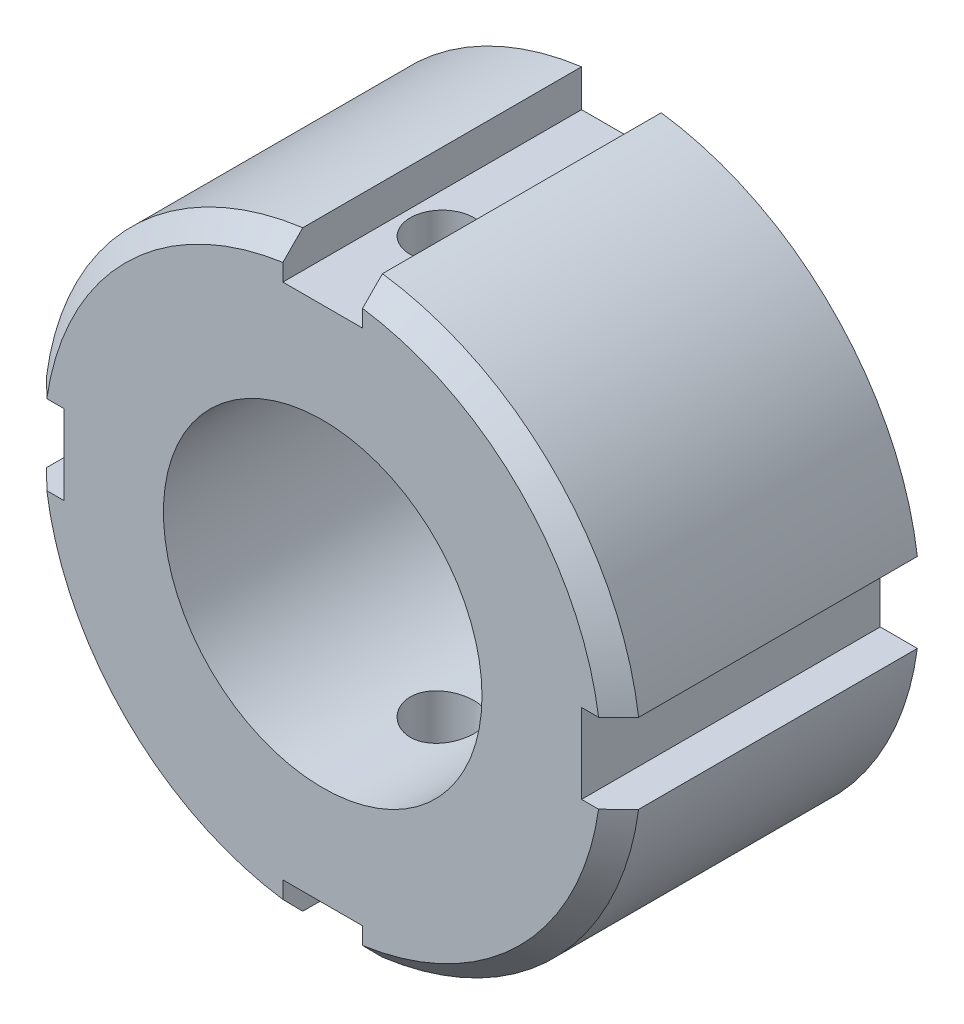
ISO-10303-21;
HEADER;
FILE_DESCRIPTION(('STEP AP214'),'2;1');
FILE_NAME('part.step','',(''),(''),'','','');
FILE_SCHEMA(('AUTOMOTIVE_DESIGN { 1 0 10303 214 1 1 1 1 }'));
ENDSEC;
DATA;
#1=APPLICATION_CONTEXT('core data for automotive mechanical design processes');
#2=APPLICATION_PROTOCOL_DEFINITION('international standard','automotive_design',2000,#1);
#3=PRODUCT_CONTEXT('',#1,'mechanical');
#4=PRODUCT('Part','Part','',(#3));
#5=PRODUCT_RELATED_PRODUCT_CATEGORY('part','',(#4));
#6=PRODUCT_DEFINITION_FORMATION('','',#4);
#7=PRODUCT_DEFINITION_CONTEXT('part definition',#1,'design');
#8=PRODUCT_DEFINITION('design','',#6,#7);
#9=PRODUCT_DEFINITION_SHAPE('','',#8);
#10=(LENGTH_UNIT() NAMED_UNIT(*) SI_UNIT(.MILLI.,.METRE.));
#11=(NAMED_UNIT(*) PLANE_ANGLE_UNIT() SI_UNIT($,.RADIAN.));
#12=(NAMED_UNIT(*) SI_UNIT($,.STERADIAN.) SOLID_ANGLE_UNIT());
#13=UNCERTAINTY_MEASURE_WITH_UNIT(LENGTH_MEASURE(1.E-05),#10,'distance_accuracy_value','');
#14=(GEOMETRIC_REPRESENTATION_CONTEXT(3) GLOBAL_UNCERTAINTY_ASSIGNED_CONTEXT((#13)) GLOBAL_UNIT_ASSIGNED_CONTEXT((#10,
#11,#12)) REPRESENTATION_CONTEXT('',''));
#15=CARTESIAN_POINT('',(0.,0.,0.));
#16=DIRECTION('',(0.,0.,1.));
#17=DIRECTION('',(1.,0.,0.));
#18=AXIS2_PLACEMENT_3D('',#15,#16,#17);
#19=CARTESIAN_POINT('',(0.,0.,15.));
#20=DIRECTION('',(0.,0.,-1.));
#21=DIRECTION('',(-1.,0.,0.));
#22=AXIS2_PLACEMENT_3D('',#19,#20,#21);
#23=CYLINDRICAL_SURFACE('',#22,15.);
#24=DIRECTION('',(0.,0.,-1.));
#25=VECTOR('',#24,1.);
#26=CARTESIAN_POINT('',(2.,14.8660687473185,15.));
#27=LINE('',#26,#25);
#28=CARTESIAN_POINT('',(2.,14.8660687473185,0.));
#29=VERTEX_POINT('',#28);
#30=CARTESIAN_POINT('',(2.,14.8660687473185,14.));
#31=VERTEX_POINT('',#30);
#32=EDGE_CURVE('E307',#29,#31,#27,.F.);
#33=ORIENTED_EDGE('',*,*,#32,.T.);
#34=CARTESIAN_POINT('',(0.,0.,14.));
#35=DIRECTION('',(0.,0.,1.));
#36=DIRECTION('',(1.,0.,0.));
#37=AXIS2_PLACEMENT_3D('',#34,#35,#36);
#38=CIRCLE('',#37,15.);
#39=CARTESIAN_POINT('',(14.8660687473185,1.99999999999995,14.));
#40=VERTEX_POINT('',#39);
#41=EDGE_CURVE('E50',#31,#40,#38,.F.);
#42=ORIENTED_EDGE('',*,*,#41,.T.);
#43=DIRECTION('',(0.,0.,-1.));
#44=VECTOR('',#43,1.);
#45=CARTESIAN_POINT('',(14.8660687473185,1.99999999999995,15.));
#46=LINE('',#45,#44);
#47=CARTESIAN_POINT('',(14.8660687473185,1.99999999999995,0.));
#48=VERTEX_POINT('',#47);
#49=EDGE_CURVE('E300',#40,#48,#46,.T.);
#50=ORIENTED_EDGE('',*,*,#49,.T.);
#51=CARTESIAN_POINT('',(0.,0.,0.));
#52=DIRECTION('',(0.,0.,1.));
#53=DIRECTION('',(1.,0.,0.));
#54=AXIS2_PLACEMENT_3D('',#51,#52,#53);
#55=CIRCLE('',#54,15.);
#56=EDGE_CURVE('E287',#48,#29,#55,.T.);
#57=ORIENTED_EDGE('',*,*,#56,.T.);
#58=EDGE_LOOP('',(#33,#42,#50,#57));
#59=FACE_BOUND('',#58,.T.);
#60=ADVANCED_FACE('F35',(#59),#23,.T.);
#61=DIRECTION('',(0.,0.,-1.));
#62=VECTOR('',#61,1.);
#63=CARTESIAN_POINT('',(14.8660687473185,-2.00000000000005,15.));
#64=LINE('',#63,#62);
#65=CARTESIAN_POINT('',(14.8660687473185,-2.00000000000005,0.));
#66=VERTEX_POINT('',#65);
#67=CARTESIAN_POINT('',(14.8660687473185,-2.00000000000005,14.));
#68=VERTEX_POINT('',#67);
#69=EDGE_CURVE('E302',#66,#68,#64,.F.);
#70=ORIENTED_EDGE('',*,*,#69,.T.);
#71=CARTESIAN_POINT('',(0.,0.,14.));
#72=DIRECTION('',(0.,0.,1.));
#73=DIRECTION('',(1.,0.,0.));
#74=AXIS2_PLACEMENT_3D('',#71,#72,#73);
#75=CIRCLE('',#74,15.);
#76=CARTESIAN_POINT('',(1.9999999999999,-14.8660687473185,14.));
#77=VERTEX_POINT('',#76);
#78=EDGE_CURVE('E329',#68,#77,#75,.F.);
#79=ORIENTED_EDGE('',*,*,#78,.T.);
#80=DIRECTION('',(0.,0.,-1.));
#81=VECTOR('',#80,1.);
#82=CARTESIAN_POINT('',(1.9999999999999,-14.8660687473185,15.));
#83=LINE('',#82,#81);
#84=CARTESIAN_POINT('',(1.9999999999999,-14.8660687473185,0.));
#85=VERTEX_POINT('',#84);
#86=EDGE_CURVE('E295',#77,#85,#83,.T.);
#87=ORIENTED_EDGE('',*,*,#86,.T.);
#88=EDGE_CURVE('E284',#85,#66,#55,.T.);
#89=ORIENTED_EDGE('',*,*,#88,.T.);
#90=EDGE_LOOP('',(#70,#79,#87,#89));
#91=FACE_BOUND('',#90,.T.);
#92=ADVANCED_FACE('F476',(#91),#23,.T.);
#93=DIRECTION('',(0.,0.,-1.));
#94=VECTOR('',#93,1.);
#95=CARTESIAN_POINT('',(-2.0000000000001,-14.8660687473185,15.));
#96=LINE('',#95,#94);
#97=CARTESIAN_POINT('',(-2.0000000000001,-14.8660687473185,0.));
#98=VERTEX_POINT('',#97);
#99=CARTESIAN_POINT('',(-2.0000000000001,-14.8660687473185,14.));
#100=VERTEX_POINT('',#99);
#101=EDGE_CURVE('E297',#98,#100,#96,.F.);
#102=ORIENTED_EDGE('',*,*,#101,.T.);
#103=CARTESIAN_POINT('',(0.,0.,14.));
#104=DIRECTION('',(0.,0.,1.));
#105=DIRECTION('',(1.,0.,0.));
#106=AXIS2_PLACEMENT_3D('',#103,#104,#105);
#107=CIRCLE('',#106,15.);
#108=CARTESIAN_POINT('',(-14.8660687473185,-1.99999999999984,14.));
#109=VERTEX_POINT('',#108);
#110=EDGE_CURVE('E369',#100,#109,#107,.F.);
#111=ORIENTED_EDGE('',*,*,#110,.T.);
#112=DIRECTION('',(0.,0.,-1.));
#113=VECTOR('',#112,1.);
#114=CARTESIAN_POINT('',(-14.8660687473185,-1.99999999999984,15.));
#115=LINE('',#114,#113);
#116=CARTESIAN_POINT('',(-14.8660687473185,-1.99999999999984,0.));
#117=VERTEX_POINT('',#116);
#118=EDGE_CURVE('E290',#109,#117,#115,.T.);
#119=ORIENTED_EDGE('',*,*,#118,.T.);
#120=EDGE_CURVE('E488',#117,#98,#55,.T.);
#121=ORIENTED_EDGE('',*,*,#120,.T.);
#122=EDGE_LOOP('',(#102,#111,#119,#121));
#123=FACE_BOUND('',#122,.T.);
#124=ADVANCED_FACE('F492',(#123),#23,.T.);
#125=CARTESIAN_POINT('',(0.,0.,15.));
#126=DIRECTION('',(0.,0.,1.));
#127=DIRECTION('',(1.,0.,0.));
#128=AXIS2_PLACEMENT_3D('',#125,#126,#127);
#129=PLANE('',#128);
#130=DIRECTION('',(0.,1.,0.));
#131=VECTOR('',#130,1.);
#132=CARTESIAN_POINT('',(1.99999999999991,-13.,15.));
#133=LINE('',#132,#131);
#134=CARTESIAN_POINT('',(1.9999999999999,-13.856406460551,15.));
#135=VERTEX_POINT('',#134);
#136=CARTESIAN_POINT('',(1.99999999999991,-13.,15.));
#137=VERTEX_POINT('',#136);
#138=EDGE_CURVE('E249',#135,#137,#133,.T.);
#139=ORIENTED_EDGE('',*,*,#138,.F.);
#140=CARTESIAN_POINT('',(0.,0.,15.));
#141=DIRECTION('',(0.,0.,1.));
#142=DIRECTION('',(1.,0.,0.));
#143=AXIS2_PLACEMENT_3D('',#140,#141,#142);
#144=CIRCLE('',#143,14.);
#145=CARTESIAN_POINT('',(13.856406460551,-2.00000000000005,15.));
#146=VERTEX_POINT('',#145);
#147=EDGE_CURVE('E318',#135,#146,#144,.T.);
#148=ORIENTED_EDGE('',*,*,#147,.T.);
#149=DIRECTION('',(1.,0.,0.));
#150=VECTOR('',#149,1.);
#151=CARTESIAN_POINT('',(13.,-2.00000000000005,15.));
#152=LINE('',#151,#150);
#153=CARTESIAN_POINT('',(13.,-2.00000000000005,15.));
#154=VERTEX_POINT('',#153);
#155=EDGE_CURVE('E220',#154,#146,#152,.T.);
#156=ORIENTED_EDGE('',*,*,#155,.F.);
#157=DIRECTION('',(0.,-1.,0.));
#158=VECTOR('',#157,1.);
#159=CARTESIAN_POINT('',(13.,1.99999999999995,15.));
#160=LINE('',#159,#158);
#161=CARTESIAN_POINT('',(13.,1.99999999999995,15.));
#162=VERTEX_POINT('',#161);
#163=EDGE_CURVE('E229',#162,#154,#160,.T.);
#164=ORIENTED_EDGE('',*,*,#163,.F.);
#165=DIRECTION('',(-1.,0.,0.));
#166=VECTOR('',#165,1.);
#167=CARTESIAN_POINT('',(13.,1.99999999999995,15.));
#168=LINE('',#167,#166);
#169=CARTESIAN_POINT('',(13.856406460551,1.99999999999995,15.));
#170=VERTEX_POINT('',#169);
#171=EDGE_CURVE('E227',#170,#162,#168,.T.);
#172=ORIENTED_EDGE('',*,*,#171,.F.);
#173=CARTESIAN_POINT('',(0.,0.,15.));
#174=DIRECTION('',(0.,0.,1.));
#175=DIRECTION('',(1.,0.,0.));
#176=AXIS2_PLACEMENT_3D('',#173,#174,#175);
#177=CIRCLE('',#176,14.);
#178=CARTESIAN_POINT('',(2.,13.856406460551,15.));
#179=VERTEX_POINT('',#178);
#180=EDGE_CURVE('E309',#170,#179,#177,.T.);
#181=ORIENTED_EDGE('',*,*,#180,.T.);
#182=DIRECTION('',(0.,1.,0.));
#183=VECTOR('',#182,1.);
#184=CARTESIAN_POINT('',(2.,13.,15.));
#185=LINE('',#184,#183);
#186=CARTESIAN_POINT('',(2.,13.,15.));
#187=VERTEX_POINT('',#186);
#188=EDGE_CURVE('E209',#187,#179,#185,.T.);
#189=ORIENTED_EDGE('',*,*,#188,.F.);
#190=DIRECTION('',(1.,0.,0.));
#191=VECTOR('',#190,1.);
#192=CARTESIAN_POINT('',(-2.,13.,15.));
#193=LINE('',#192,#191);
#194=CARTESIAN_POINT('',(-2.,13.,15.));
#195=VERTEX_POINT('',#194);
#196=EDGE_CURVE('E205',#195,#187,#193,.T.);
#197=ORIENTED_EDGE('',*,*,#196,.F.);
#198=DIRECTION('',(0.,-1.,0.));
#199=VECTOR('',#198,1.);
#200=CARTESIAN_POINT('',(-2.,13.,15.));
#201=LINE('',#200,#199);
#202=CARTESIAN_POINT('',(-2.,13.856406460551,15.));
#203=VERTEX_POINT('',#202);
#204=EDGE_CURVE('E185',#203,#195,#201,.T.);
#205=ORIENTED_EDGE('',*,*,#204,.F.);
#206=CARTESIAN_POINT('',(0.,0.,15.));
#207=DIRECTION('',(0.,0.,1.));
#208=DIRECTION('',(1.,0.,0.));
#209=AXIS2_PLACEMENT_3D('',#206,#207,#208);
#210=CIRCLE('',#209,14.);
#211=CARTESIAN_POINT('',(-13.856406460551,2.00000000000015,15.));
#212=VERTEX_POINT('',#211);
#213=EDGE_CURVE('E312',#203,#212,#210,.T.);
#214=ORIENTED_EDGE('',*,*,#213,.T.);
#215=DIRECTION('',(-1.,0.,0.));
#216=VECTOR('',#215,1.);
#217=CARTESIAN_POINT('',(-13.,2.00000000000014,15.));
#218=LINE('',#217,#216);
#219=CARTESIAN_POINT('',(-13.,2.00000000000014,15.));
#220=VERTEX_POINT('',#219);
#221=EDGE_CURVE('E264',#220,#212,#218,.T.);
#222=ORIENTED_EDGE('',*,*,#221,.F.);
#223=DIRECTION('',(0.,1.,0.));
#224=VECTOR('',#223,1.);
#225=CARTESIAN_POINT('',(-13.,-1.99999999999986,15.));
#226=LINE('',#225,#224);
#227=CARTESIAN_POINT('',(-13.,-1.99999999999986,15.));
#228=VERTEX_POINT('',#227);
#229=EDGE_CURVE('E272',#228,#220,#226,.T.);
#230=ORIENTED_EDGE('',*,*,#229,.F.);
#231=DIRECTION('',(1.,0.,0.));
#232=VECTOR('',#231,1.);
#233=CARTESIAN_POINT('',(-13.,-1.99999999999986,15.));
#234=LINE('',#233,#232);
#235=CARTESIAN_POINT('',(-13.856406460551,-1.99999999999985,15.));
#236=VERTEX_POINT('',#235);
#237=EDGE_CURVE('E270',#236,#228,#234,.T.);
#238=ORIENTED_EDGE('',*,*,#237,.F.);
#239=CARTESIAN_POINT('',(0.,0.,15.));
#240=DIRECTION('',(0.,0.,1.));
#241=DIRECTION('',(1.,0.,0.));
#242=AXIS2_PLACEMENT_3D('',#239,#240,#241);
#243=CIRCLE('',#242,14.);
#244=CARTESIAN_POINT('',(-2.0000000000001,-13.856406460551,15.));
#245=VERTEX_POINT('',#244);
#246=EDGE_CURVE('E315',#236,#245,#243,.T.);
#247=ORIENTED_EDGE('',*,*,#246,.T.);
#248=DIRECTION('',(0.,-1.,0.));
#249=VECTOR('',#248,1.);
#250=CARTESIAN_POINT('',(-2.00000000000009,-13.,15.));
#251=LINE('',#250,#249);
#252=CARTESIAN_POINT('',(-2.00000000000009,-13.,15.));
#253=VERTEX_POINT('',#252);
#254=EDGE_CURVE('E242',#253,#245,#251,.T.);
#255=ORIENTED_EDGE('',*,*,#254,.F.);
#256=DIRECTION('',(-1.,0.,0.));
#257=VECTOR('',#256,1.);
#258=CARTESIAN_POINT('',(1.99999999999991,-13.,15.));
#259=LINE('',#258,#257);
#260=EDGE_CURVE('E251',#137,#253,#259,.T.);
#261=ORIENTED_EDGE('',*,*,#260,.F.);
#262=EDGE_LOOP('',(#139,#148,#156,#164,#172,#181,#189,#197,#205,#214,#222,#230,#238,#247,#255,#261));
#263=FACE_BOUND('',#262,.T.);
#264=CARTESIAN_POINT('',(0.,0.,15.));
#265=DIRECTION('',(0.,0.,1.));
#266=DIRECTION('',(1.,0.,0.));
#267=AXIS2_PLACEMENT_3D('',#264,#265,#266);
#268=CIRCLE('',#267,8.);
#269=CARTESIAN_POINT('',(8.,0.,15.));
#270=VERTEX_POINT('',#269);
#271=EDGE_CURVE('E281',#270,#270,#268,.T.);
#272=ORIENTED_EDGE('',*,*,#271,.F.);
#273=EDGE_LOOP('',(#272));
#274=FACE_BOUND('',#273,.T.);
#275=ADVANCED_FACE('F414',(#263,#274),#129,.T.);
#276=CARTESIAN_POINT('',(0.,0.,0.));
#277=DIRECTION('',(0.,0.,1.));
#278=DIRECTION('',(1.,0.,0.));
#279=AXIS2_PLACEMENT_3D('',#276,#277,#278);
#280=PLANE('',#279);
#281=DIRECTION('',(1.,0.,0.));
#282=VECTOR('',#281,1.);
#283=CARTESIAN_POINT('',(-2.,13.,0.));
#284=LINE('',#283,#282);
#285=CARTESIAN_POINT('',(-2.,13.,0.));
#286=VERTEX_POINT('',#285);
#287=CARTESIAN_POINT('',(2.,13.,0.));
#288=VERTEX_POINT('',#287);
#289=EDGE_CURVE('E190',#286,#288,#284,.T.);
#290=ORIENTED_EDGE('',*,*,#289,.T.);
#291=DIRECTION('',(0.,1.,0.));
#292=VECTOR('',#291,1.);
#293=CARTESIAN_POINT('',(2.,13.,0.));
#294=LINE('',#293,#292);
#295=EDGE_CURVE('E203',#288,#29,#294,.T.);
#296=ORIENTED_EDGE('',*,*,#295,.T.);
#297=ORIENTED_EDGE('',*,*,#56,.F.);
#298=DIRECTION('',(-1.,0.,0.));
#299=VECTOR('',#298,1.);
#300=CARTESIAN_POINT('',(13.,1.99999999999995,0.));
#301=LINE('',#300,#299);
#302=CARTESIAN_POINT('',(13.,1.99999999999995,0.));
#303=VERTEX_POINT('',#302);
#304=EDGE_CURVE('E216',#48,#303,#301,.T.);
#305=ORIENTED_EDGE('',*,*,#304,.T.);
#306=DIRECTION('',(0.,-1.,0.));
#307=VECTOR('',#306,1.);
#308=CARTESIAN_POINT('',(13.,1.99999999999995,0.));
#309=LINE('',#308,#307);
#310=CARTESIAN_POINT('',(13.,-2.00000000000005,0.));
#311=VERTEX_POINT('',#310);
#312=EDGE_CURVE('E219',#303,#311,#309,.T.);
#313=ORIENTED_EDGE('',*,*,#312,.T.);
#314=DIRECTION('',(1.,0.,0.));
#315=VECTOR('',#314,1.);
#316=CARTESIAN_POINT('',(13.,-2.00000000000005,0.));
#317=LINE('',#316,#315);
#318=EDGE_CURVE('E223',#311,#66,#317,.T.);
#319=ORIENTED_EDGE('',*,*,#318,.T.);
#320=ORIENTED_EDGE('',*,*,#88,.F.);
#321=DIRECTION('',(0.,1.,0.));
#322=VECTOR('',#321,1.);
#323=CARTESIAN_POINT('',(1.99999999999991,-13.,0.));
#324=LINE('',#323,#322);
#325=CARTESIAN_POINT('',(1.99999999999991,-13.,0.));
#326=VERTEX_POINT('',#325);
#327=EDGE_CURVE('E238',#85,#326,#324,.T.);
#328=ORIENTED_EDGE('',*,*,#327,.T.);
#329=DIRECTION('',(-1.,0.,0.));
#330=VECTOR('',#329,1.);
#331=CARTESIAN_POINT('',(1.99999999999991,-13.,0.));
#332=LINE('',#331,#330);
#333=CARTESIAN_POINT('',(-2.00000000000009,-13.,0.));
#334=VERTEX_POINT('',#333);
#335=EDGE_CURVE('E241',#326,#334,#332,.T.);
#336=ORIENTED_EDGE('',*,*,#335,.T.);
#337=DIRECTION('',(0.,-1.,0.));
#338=VECTOR('',#337,1.);
#339=CARTESIAN_POINT('',(-2.00000000000009,-13.,0.));
#340=LINE('',#339,#338);
#341=EDGE_CURVE('E245',#334,#98,#340,.T.);
#342=ORIENTED_EDGE('',*,*,#341,.T.);
#343=ORIENTED_EDGE('',*,*,#120,.F.);
#344=DIRECTION('',(1.,0.,0.));
#345=VECTOR('',#344,1.);
#346=CARTESIAN_POINT('',(-13.,-1.99999999999986,0.));
#347=LINE('',#346,#345);
#348=CARTESIAN_POINT('',(-13.,-1.99999999999986,0.));
#349=VERTEX_POINT('',#348);
#350=EDGE_CURVE('E260',#117,#349,#347,.T.);
#351=ORIENTED_EDGE('',*,*,#350,.T.);
#352=DIRECTION('',(0.,1.,0.));
#353=VECTOR('',#352,1.);
#354=CARTESIAN_POINT('',(-13.,-1.99999999999986,0.));
#355=LINE('',#354,#353);
#356=CARTESIAN_POINT('',(-13.,2.00000000000014,0.));
#357=VERTEX_POINT('',#356);
#358=EDGE_CURVE('E263',#349,#357,#355,.T.);
#359=ORIENTED_EDGE('',*,*,#358,.T.);
#360=DIRECTION('',(-1.,0.,0.));
#361=VECTOR('',#360,1.);
#362=CARTESIAN_POINT('',(-13.,2.00000000000014,0.));
#363=LINE('',#362,#361);
#364=CARTESIAN_POINT('',(-14.8660687473185,2.00000000000016,0.));
#365=VERTEX_POINT('',#364);
#366=EDGE_CURVE('E267',#357,#365,#363,.T.);
#367=ORIENTED_EDGE('',*,*,#366,.T.);
#368=CARTESIAN_POINT('',(-2.,14.8660687473185,0.));
#369=VERTEX_POINT('',#368);
#370=EDGE_CURVE('E202',#369,#365,#55,.T.);
#371=ORIENTED_EDGE('',*,*,#370,.F.);
#372=DIRECTION('',(0.,-1.,0.));
#373=VECTOR('',#372,1.);
#374=CARTESIAN_POINT('',(-2.,13.,0.));
#375=LINE('',#374,#373);
#376=EDGE_CURVE('E182',#369,#286,#375,.T.);
#377=ORIENTED_EDGE('',*,*,#376,.T.);
#378=EDGE_LOOP('',(#290,#296,#297,#305,#313,#319,#320,#328,#336,#342,#343,#351,#359,#367,#371,#377));
#379=FACE_BOUND('',#378,.T.);
#380=CARTESIAN_POINT('',(0.,0.,0.));
#381=DIRECTION('',(0.,0.,1.));
#382=DIRECTION('',(1.,0.,0.));
#383=AXIS2_PLACEMENT_3D('',#380,#381,#382);
#384=CIRCLE('',#383,8.);
#385=CARTESIAN_POINT('',(8.,0.,0.));
#386=VERTEX_POINT('',#385);
#387=EDGE_CURVE('E214',#386,#386,#384,.T.);
#388=ORIENTED_EDGE('',*,*,#387,.T.);
#389=EDGE_LOOP('',(#388));
#390=FACE_BOUND('',#389,.T.);
#391=ADVANCED_FACE('F198',(#379,#390),#280,.F.);
#392=DIRECTION('',(0.,0.,-1.));
#393=VECTOR('',#392,1.);
#394=CARTESIAN_POINT('',(-14.8660687473185,2.00000000000016,15.));
#395=LINE('',#394,#393);
#396=CARTESIAN_POINT('',(-14.8660687473185,2.00000000000016,14.));
#397=VERTEX_POINT('',#396);
#398=EDGE_CURVE('E292',#365,#397,#395,.F.);
#399=ORIENTED_EDGE('',*,*,#398,.T.);
#400=CARTESIAN_POINT('',(0.,0.,14.));
#401=DIRECTION('',(0.,0.,1.));
#402=DIRECTION('',(1.,0.,0.));
#403=AXIS2_PLACEMENT_3D('',#400,#401,#402);
#404=CIRCLE('',#403,15.);
#405=CARTESIAN_POINT('',(-2.,14.8660687473185,14.));
#406=VERTEX_POINT('',#405);
#407=EDGE_CURVE('E446',#397,#406,#404,.F.);
#408=ORIENTED_EDGE('',*,*,#407,.T.);
#409=DIRECTION('',(0.,0.,-1.));
#410=VECTOR('',#409,1.);
#411=CARTESIAN_POINT('',(-2.,14.8660687473185,15.));
#412=LINE('',#411,#410);
#413=EDGE_CURVE('E305',#406,#369,#412,.T.);
#414=ORIENTED_EDGE('',*,*,#413,.T.);
#415=ORIENTED_EDGE('',*,*,#370,.T.);
#416=EDGE_LOOP('',(#399,#408,#414,#415));
#417=FACE_BOUND('',#416,.T.);
#418=ADVANCED_FACE('F412',(#417),#23,.T.);
#419=CARTESIAN_POINT('',(0.,0.,15.));
#420=DIRECTION('',(0.,0.,-1.));
#421=DIRECTION('',(-1.,0.,0.));
#422=AXIS2_PLACEMENT_3D('',#419,#420,#421);
#423=CYLINDRICAL_SURFACE('',#422,8.);
#424=CARTESIAN_POINT('',(0.,-8.,10.6005262176611));
#425=CARTESIAN_POINT('',(0.08895168081611,-7.99999836067097,10.6005229461362));
#426=CARTESIAN_POINT('',(0.177944713970971,-7.99850119869921,10.5930857256324));
#427=CARTESIAN_POINT('',(0.353415274500347,-7.99267313565797,10.5635569960445));
#428=CARTESIAN_POINT('',(0.439890747133014,-7.98833998413059,10.5414538488371));
#429=CARTESIAN_POINT('',(0.607763810411306,-7.97732379565077,10.4833034359129));
#430=CARTESIAN_POINT('',(0.689166179753969,-7.97064301072111,10.4472695302983));
#431=CARTESIAN_POINT('',(0.844764182198553,-7.95565780409192,10.3623201796278));
#432=CARTESIAN_POINT('',(0.918960243327485,-7.94735347891284,10.3134055002816));
#433=CARTESIAN_POINT('',(1.059050558543,-7.92990932574736,10.2033803675498));
#434=CARTESIAN_POINT('',(1.12483308872501,-7.92076057833249,10.1421290610659));
#435=CARTESIAN_POINT('',(1.24526161198558,-7.90272358652009,10.0094721574392));
#436=CARTESIAN_POINT('',(1.29990673488839,-7.8938353625239,9.93806576760979));
#437=CARTESIAN_POINT('',(1.39698486745498,-7.87723866695357,9.78632195500824));
#438=CARTESIAN_POINT('',(1.43930218218438,-7.86954167117689,9.70590915015149));
#439=CARTESIAN_POINT('',(1.5097822764721,-7.85632558205893,9.53893523763752));
#440=CARTESIAN_POINT('',(1.53794645532612,-7.85080627342514,9.4523747387582));
#441=CARTESIAN_POINT('',(1.57895808175377,-7.84266071341059,9.2767646311373));
#442=CARTESIAN_POINT('',(1.59200155311668,-7.83999747096113,9.1877625522266));
#443=CARTESIAN_POINT('',(1.60301037679511,-7.83775424270789,9.00879650184675));
#444=CARTESIAN_POINT('',(1.60097727191718,-7.8381739414225,8.91883262973999));
#445=CARTESIAN_POINT('',(1.58204914051488,-7.84201556663132,8.74193097834855));
#446=CARTESIAN_POINT('',(1.56537883985148,-7.84539209464484,8.65496802089832));
#447=CARTESIAN_POINT('',(1.51800425114821,-7.85469544421827,8.48509860497823));
#448=CARTESIAN_POINT('',(1.4872992924926,-7.86062238764347,8.40219234055825));
#449=CARTESIAN_POINT('',(1.41251243301661,-7.87440515987523,8.24214213460432));
#450=CARTESIAN_POINT('',(1.3683414679433,-7.88227376270052,8.16504095584347));
#451=CARTESIAN_POINT('',(1.2679392887475,-7.89904505970019,8.01926070301667));
#452=CARTESIAN_POINT('',(1.21170668772072,-7.90794787273896,7.95058259890449));
#453=CARTESIAN_POINT('',(1.08757431026351,-7.92598113493423,7.82230130996232));
#454=CARTESIAN_POINT('',(1.01948273630137,-7.93511279695489,7.76288373465055));
#455=CARTESIAN_POINT('',(0.874202627107138,-7.95242809981412,7.65628453156732));
#456=CARTESIAN_POINT('',(0.797013975078149,-7.96061172847825,7.60910306091945));
#457=CARTESIAN_POINT('',(0.635524565251257,-7.975129023706,7.52828099561636));
#458=CARTESIAN_POINT('',(0.551212905410174,-7.98145978577656,7.4946616295972));
#459=CARTESIAN_POINT('',(0.377983406374371,-7.99153599515201,7.44211606237305));
#460=CARTESIAN_POINT('',(0.289066126926362,-7.99528175583768,7.42318808009085));
#461=CARTESIAN_POINT('',(0.110744428692621,-7.99972227014862,7.40082538159578));
#462=CARTESIAN_POINT('',(0.0213730712413937,-8.00046703913705,7.39713665709835));
#463=CARTESIAN_POINT('',(-0.156709000361893,-7.99896058144946,7.40467309214075));
#464=CARTESIAN_POINT('',(-0.245419751394897,-7.99670952330751,7.41589741272816));
#465=CARTESIAN_POINT('',(-0.41884291608874,-7.98949564284729,7.45273029766327));
#466=CARTESIAN_POINT('',(-0.503584124972313,-7.98455740388021,7.47820852041487));
#467=CARTESIAN_POINT('',(-0.667591592224939,-7.9725208826281,7.54268353703466));
#468=CARTESIAN_POINT('',(-0.746857439673138,-7.96542243843728,7.58168134421622));
#469=CARTESIAN_POINT('',(-0.898735286065205,-7.94972838126389,7.67263796757937));
#470=CARTESIAN_POINT('',(-0.971253885456263,-7.94111549393169,7.72474969713749));
#471=CARTESIAN_POINT('',(-1.1066082443733,-7.92338856303505,7.84025016663096));
#472=CARTESIAN_POINT('',(-1.16944296367993,-7.91427446577429,7.90364011647242));
#473=CARTESIAN_POINT('',(-1.28462632598403,-7.89640372813791,8.04105396630192));
#474=CARTESIAN_POINT('',(-1.3368005868226,-7.88765465122545,8.1152251912198));
#475=CARTESIAN_POINT('',(-1.42795050810163,-7.87166485786363,8.27142795305103));
#476=CARTESIAN_POINT('',(-1.4669266968014,-7.86442408104828,8.35345917519547));
#477=CARTESIAN_POINT('',(-1.53033606147443,-7.85233181548617,8.52264007796829));
#478=CARTESIAN_POINT('',(-1.55484466178227,-7.84746795836094,8.60976056316172));
#479=CARTESIAN_POINT('',(-1.58885185320124,-7.84065405307902,8.78699080155466));
#480=CARTESIAN_POINT('',(-1.59835240316428,-7.83870362466319,8.87710016307804));
#481=CARTESIAN_POINT('',(-1.60200127536052,-7.83795853231205,9.05599941740457));
#482=CARTESIAN_POINT('',(-1.59642515657664,-7.83910722436301,9.14478356856456));
#483=CARTESIAN_POINT('',(-1.57068717063597,-7.84430437919269,9.32012093830454));
#484=CARTESIAN_POINT('',(-1.55052542081263,-7.84835281864451,9.40667417482521));
#485=CARTESIAN_POINT('',(-1.49631144595819,-7.85886797768325,9.57491730851465));
#486=CARTESIAN_POINT('',(-1.46229303286484,-7.86532880756987,9.65661849314415));
#487=CARTESIAN_POINT('',(-1.38136303230255,-7.87994413992204,9.81319675953699));
#488=CARTESIAN_POINT('',(-1.33445036280303,-7.8880987845112,9.88807326790034));
#489=CARTESIAN_POINT('',(-1.22812245303831,-7.905356224274,10.0302487833112));
#490=CARTESIAN_POINT('',(-1.1685082221735,-7.91447278160178,10.0973973292022));
#491=CARTESIAN_POINT('',(-1.03888019771583,-7.93252808164594,10.2208289448468));
#492=CARTESIAN_POINT('',(-0.968864017367928,-7.94146678301762,10.2771095140801));
#493=CARTESIAN_POINT('',(-0.819538400780694,-7.95826960738476,10.377764190573));
#494=CARTESIAN_POINT('',(-0.740139312009415,-7.96612149526224,10.4220074218752));
#495=CARTESIAN_POINT('',(-0.574898389410983,-7.97974555217792,10.4964532269618));
#496=CARTESIAN_POINT('',(-0.489062442666261,-7.98551959422385,10.5266684530089));
#497=CARTESIAN_POINT('',(-0.335861810073078,-7.9932160011575,10.5663504868174));
#498=CARTESIAN_POINT('',(-0.269369069332644,-7.99574510936023,10.5791435299358));
#499=CARTESIAN_POINT('',(-0.135258832434782,-7.99913770550386,10.5962325036727));
#500=CARTESIAN_POINT('',(-0.0676413722360048,-8.00000124659213,10.6005287054211));
#501=CARTESIAN_POINT('',(0.,-8.,10.6005262176611));
#502=B_SPLINE_CURVE_WITH_KNOTS('',3,(#424,#425,#426,#427,#428,#429,#430,#431,#432,#433,#434,
#435,#436,#437,#438,#439,#440,#441,#442,#443,#444,#445,#446,#447,#448,#449,#450,#451,#452,#453,
#454,#455,#456,#457,#458,#459,#460,#461,#462,#463,#464,#465,#466,#467,#468,#469,#470,#471,#472,
#473,#474,#475,#476,#477,#478,#479,#480,#481,#482,#483,#484,#485,#486,#487,#488,#489,#490,#491,
#492,#493,#494,#495,#496,#497,#498,#499,#500,#501),.UNSPECIFIED.,.T.,.F.,(4,2,2,2,2,2,2,2,2,2,2,
2,2,2,2,2,2,2,2,2,2,2,2,2,2,2,2,2,2,2,2,2,2,2,2,2,2,2,4),(0.,0.266607589427474,
0.533426998324911,0.799991149992346,1.06653945907877,1.3363237960543,1.60612920345154,
1.87839064785492,2.15062516894864,2.41928953620239,2.68792641104526,2.95250961829087,
3.21710546939394,3.48349079002879,3.74990675735081,4.021118425852,4.29233357680455,
4.56397162621688,4.83557673904886,5.10263600199734,5.3696802418216,5.63432155524082,
5.89898270821772,6.16688580875403,6.4348176667761,6.70683238533067,6.97883621507532,
7.24940918024519,7.51994682729159,7.7855733914056,8.05119781872249,8.31617793643927,
8.5811802969407,8.85068781074036,9.12025725954035,9.39265004346024,9.6647966688925,
9.86753908483984,10.0702750312767),.UNSPECIFIED.);
#503=CARTESIAN_POINT('',(0.,-8.,10.6005262176611));
#504=VERTEX_POINT('',#503);
#505=EDGE_CURVE('E273',#504,#504,#502,.T.);
#506=ORIENTED_EDGE('',*,*,#505,.F.);
#507=EDGE_LOOP('',(#506));
#508=FACE_BOUND('',#507,.T.);
#509=CARTESIAN_POINT('',(0.,8.,10.6005262176611));
#510=CARTESIAN_POINT('',(-0.08895168081611,7.99999836067097,10.6005229461362));
#511=CARTESIAN_POINT('',(-0.177944713970971,7.99850119869921,10.5930857256324));
#512=CARTESIAN_POINT('',(-0.353415274500347,7.99267313565797,10.5635569960445));
#513=CARTESIAN_POINT('',(-0.439890747133014,7.98833998413059,10.5414538488371));
#514=CARTESIAN_POINT('',(-0.607763810411306,7.97732379565077,10.4833034359129));
#515=CARTESIAN_POINT('',(-0.689166179753969,7.97064301072111,10.4472695302983));
#516=CARTESIAN_POINT('',(-0.844764182198553,7.95565780409192,10.3623201796278));
#517=CARTESIAN_POINT('',(-0.918960243327485,7.94735347891284,10.3134055002816));
#518=CARTESIAN_POINT('',(-1.059050558543,7.92990932574736,10.2033803675498));
#519=CARTESIAN_POINT('',(-1.12483308872501,7.92076057833249,10.1421290610659));
#520=CARTESIAN_POINT('',(-1.24526161198558,7.90272358652009,10.0094721574392));
#521=CARTESIAN_POINT('',(-1.29990673488839,7.8938353625239,9.93806576760979));
#522=CARTESIAN_POINT('',(-1.39698486745498,7.87723866695357,9.78632195500824));
#523=CARTESIAN_POINT('',(-1.43930218218438,7.86954167117689,9.70590915015149));
#524=CARTESIAN_POINT('',(-1.5097822764721,7.85632558205893,9.53893523763752));
#525=CARTESIAN_POINT('',(-1.53794645532612,7.85080627342514,9.4523747387582));
#526=CARTESIAN_POINT('',(-1.57895808175377,7.84266071341059,9.2767646311373));
#527=CARTESIAN_POINT('',(-1.59200155311668,7.83999747096113,9.1877625522266));
#528=CARTESIAN_POINT('',(-1.60301037679511,7.83775424270789,9.00879650184675));
#529=CARTESIAN_POINT('',(-1.60097727191718,7.8381739414225,8.91883262973999));
#530=CARTESIAN_POINT('',(-1.58204914051488,7.84201556663132,8.74193097834855));
#531=CARTESIAN_POINT('',(-1.56537883985148,7.84539209464484,8.65496802089832));
#532=CARTESIAN_POINT('',(-1.51800425114821,7.85469544421827,8.48509860497823));
#533=CARTESIAN_POINT('',(-1.4872992924926,7.86062238764347,8.40219234055825));
#534=CARTESIAN_POINT('',(-1.41251243301661,7.87440515987523,8.24214213460432));
#535=CARTESIAN_POINT('',(-1.3683414679433,7.88227376270052,8.16504095584347));
#536=CARTESIAN_POINT('',(-1.2679392887475,7.89904505970019,8.01926070301667));
#537=CARTESIAN_POINT('',(-1.21170668772072,7.90794787273896,7.95058259890449));
#538=CARTESIAN_POINT('',(-1.08757431026351,7.92598113493423,7.82230130996232));
#539=CARTESIAN_POINT('',(-1.01948273630137,7.93511279695489,7.76288373465055));
#540=CARTESIAN_POINT('',(-0.874202627107138,7.95242809981412,7.65628453156732));
#541=CARTESIAN_POINT('',(-0.797013975078149,7.96061172847825,7.60910306091945));
#542=CARTESIAN_POINT('',(-0.635524565251257,7.975129023706,7.52828099561636));
#543=CARTESIAN_POINT('',(-0.551212905410174,7.98145978577656,7.4946616295972));
#544=CARTESIAN_POINT('',(-0.377983406374371,7.99153599515201,7.44211606237305));
#545=CARTESIAN_POINT('',(-0.289066126926362,7.99528175583768,7.42318808009085));
#546=CARTESIAN_POINT('',(-0.110744428692621,7.99972227014862,7.40082538159578));
#547=CARTESIAN_POINT('',(-0.0213730712413937,8.00046703913705,7.39713665709835));
#548=CARTESIAN_POINT('',(0.156709000361893,7.99896058144946,7.40467309214075));
#549=CARTESIAN_POINT('',(0.245419751394897,7.99670952330751,7.41589741272816));
#550=CARTESIAN_POINT('',(0.41884291608874,7.98949564284729,7.45273029766327));
#551=CARTESIAN_POINT('',(0.503584124972313,7.98455740388021,7.47820852041487));
#552=CARTESIAN_POINT('',(0.667591592224939,7.9725208826281,7.54268353703466));
#553=CARTESIAN_POINT('',(0.746857439673138,7.96542243843728,7.58168134421622));
#554=CARTESIAN_POINT('',(0.898735286065205,7.94972838126389,7.67263796757937));
#555=CARTESIAN_POINT('',(0.971253885456263,7.94111549393169,7.72474969713749));
#556=CARTESIAN_POINT('',(1.1066082443733,7.92338856303505,7.84025016663096));
#557=CARTESIAN_POINT('',(1.16944296367993,7.91427446577429,7.90364011647242));
#558=CARTESIAN_POINT('',(1.28462632598403,7.89640372813791,8.04105396630192));
#559=CARTESIAN_POINT('',(1.3368005868226,7.88765465122545,8.1152251912198));
#560=CARTESIAN_POINT('',(1.42795050810163,7.87166485786363,8.27142795305103));
#561=CARTESIAN_POINT('',(1.4669266968014,7.86442408104828,8.35345917519547));
#562=CARTESIAN_POINT('',(1.53033606147443,7.85233181548617,8.52264007796829));
#563=CARTESIAN_POINT('',(1.55484466178227,7.84746795836094,8.60976056316172));
#564=CARTESIAN_POINT('',(1.58885185320124,7.84065405307902,8.78699080155466));
#565=CARTESIAN_POINT('',(1.59835240316428,7.83870362466319,8.87710016307804));
#566=CARTESIAN_POINT('',(1.60200127536052,7.83795853231205,9.05599941740457));
#567=CARTESIAN_POINT('',(1.59642515657664,7.83910722436301,9.14478356856456));
#568=CARTESIAN_POINT('',(1.57068717063597,7.84430437919269,9.32012093830454));
#569=CARTESIAN_POINT('',(1.55052542081263,7.84835281864451,9.40667417482521));
#570=CARTESIAN_POINT('',(1.49631144595819,7.85886797768325,9.57491730851465));
#571=CARTESIAN_POINT('',(1.46229303286484,7.86532880756987,9.65661849314415));
#572=CARTESIAN_POINT('',(1.38136303230255,7.87994413992204,9.81319675953699));
#573=CARTESIAN_POINT('',(1.33445036280303,7.8880987845112,9.88807326790034));
#574=CARTESIAN_POINT('',(1.22812245303831,7.905356224274,10.0302487833112));
#575=CARTESIAN_POINT('',(1.1685082221735,7.91447278160178,10.0973973292022));
#576=CARTESIAN_POINT('',(1.03888019771583,7.93252808164594,10.2208289448468));
#577=CARTESIAN_POINT('',(0.968864017367928,7.94146678301762,10.2771095140801));
#578=CARTESIAN_POINT('',(0.819538400780694,7.95826960738476,10.377764190573));
#579=CARTESIAN_POINT('',(0.740139312009415,7.96612149526224,10.4220074218752));
#580=CARTESIAN_POINT('',(0.574898389410983,7.97974555217792,10.4964532269618));
#581=CARTESIAN_POINT('',(0.489062442666261,7.98551959422385,10.5266684530089));
#582=CARTESIAN_POINT('',(0.335861810073078,7.9932160011575,10.5663504868174));
#583=CARTESIAN_POINT('',(0.269369069332644,7.99574510936023,10.5791435299358));
#584=CARTESIAN_POINT('',(0.135258832434782,7.99913770550386,10.5962325036727));
#585=CARTESIAN_POINT('',(0.0676413722360048,8.00000124659213,10.6005287054211));
#586=CARTESIAN_POINT('',(0.,8.,10.6005262176611));
#587=B_SPLINE_CURVE_WITH_KNOTS('',3,(#509,#510,#511,#512,#513,#514,#515,#516,#517,#518,#519,
#520,#521,#522,#523,#524,#525,#526,#527,#528,#529,#530,#531,#532,#533,#534,#535,#536,#537,#538,
#539,#540,#541,#542,#543,#544,#545,#546,#547,#548,#549,#550,#551,#552,#553,#554,#555,#556,#557,
#558,#559,#560,#561,#562,#563,#564,#565,#566,#567,#568,#569,#570,#571,#572,#573,#574,#575,#576,
#577,#578,#579,#580,#581,#582,#583,#584,#585,#586),.UNSPECIFIED.,.T.,.F.,(4,2,2,2,2,2,2,2,2,2,2,
2,2,2,2,2,2,2,2,2,2,2,2,2,2,2,2,2,2,2,2,2,2,2,2,2,2,2,4),(0.,0.266607589427474,
0.533426998324911,0.799991149992346,1.06653945907877,1.3363237960543,1.60612920345154,
1.87839064785492,2.15062516894864,2.41928953620239,2.68792641104526,2.95250961829087,
3.21710546939394,3.48349079002879,3.74990675735081,4.021118425852,4.29233357680455,
4.56397162621688,4.83557673904886,5.10263600199734,5.3696802418216,5.63432155524082,
5.89898270821772,6.16688580875403,6.4348176667761,6.70683238533067,6.97883621507532,
7.24940918024519,7.51994682729159,7.7855733914056,8.05119781872249,8.31617793643927,
8.5811802969407,8.85068781074036,9.12025725954035,9.39265004346024,9.6647966688925,
9.86753908483984,10.0702750312767),.UNSPECIFIED.);
#588=CARTESIAN_POINT('',(0.,8.,10.6005262176611));
#589=VERTEX_POINT('',#588);
#590=EDGE_CURVE('E418',#589,#589,#587,.T.);
#591=ORIENTED_EDGE('',*,*,#590,.F.);
#592=EDGE_LOOP('',(#591));
#593=FACE_BOUND('',#592,.T.);
#594=ORIENTED_EDGE('',*,*,#271,.T.);
#595=EDGE_LOOP('',(#594));
#596=FACE_BOUND('',#595,.T.);
#597=ORIENTED_EDGE('',*,*,#387,.F.);
#598=EDGE_LOOP('',(#597));
#599=FACE_BOUND('',#598,.T.);
#600=ADVANCED_FACE('F408',(#508,#593,#596,#599),#423,.F.);
#601=CARTESIAN_POINT('',(-13.,2.00000000000014,0.));
#602=DIRECTION('',(0.,1.,0.));
#603=DIRECTION('',(-1.,0.,0.));
#604=AXIS2_PLACEMENT_3D('',#601,#602,#603);
#605=PLANE('',#604);
#606=ORIENTED_EDGE('',*,*,#221,.T.);
#607=CARTESIAN_POINT('',(-13.856406460551,2.00000000000015,15.));
#608=CARTESIAN_POINT('',(-14.0247393045906,2.00000000000015,14.8333896683725));
#609=CARTESIAN_POINT('',(-14.193044250589,2.00000000000015,14.6667511691449));
#610=CARTESIAN_POINT('',(-14.5295983461781,2.00000000000015,14.3334178358115));
#611=CARTESIAN_POINT('',(-14.6978474957689,2.00000000000015,14.1667230017058));
#612=CARTESIAN_POINT('',(-14.8660687473185,2.00000000000016,14.));
#613=B_SPLINE_CURVE_WITH_KNOTS('',3,(#607,#608,#609,#610,#611,#612),.UNSPECIFIED.,.F.,.F.,(4,2,
4),(0.,0.710531138269907,1.42106227516682),.UNSPECIFIED.);
#614=EDGE_CURVE('E394',#212,#397,#613,.T.);
#615=ORIENTED_EDGE('',*,*,#614,.T.);
#616=ORIENTED_EDGE('',*,*,#398,.F.);
#617=ORIENTED_EDGE('',*,*,#366,.F.);
#618=DIRECTION('',(0.,0.,1.));
#619=VECTOR('',#618,1.);
#620=CARTESIAN_POINT('',(-13.,2.00000000000014,0.));
#621=LINE('',#620,#619);
#622=EDGE_CURVE('E252',#357,#220,#621,.T.);
#623=ORIENTED_EDGE('',*,*,#622,.T.);
#624=EDGE_LOOP('',(#606,#615,#616,#617,#623));
#625=FACE_BOUND('',#624,.T.);
#626=ADVANCED_FACE('F406',(#625),#605,.F.);
#627=CARTESIAN_POINT('',(-13.,-1.99999999999986,0.));
#628=DIRECTION('',(0.,-1.,0.));
#629=DIRECTION('',(1.,0.,0.));
#630=AXIS2_PLACEMENT_3D('',#627,#628,#629);
#631=PLANE('',#630);
#632=ORIENTED_EDGE('',*,*,#118,.F.);
#633=CARTESIAN_POINT('',(-14.8660687473185,-1.99999999999984,14.));
#634=CARTESIAN_POINT('',(-14.6978474957689,-1.99999999999985,14.1667230017058));
#635=CARTESIAN_POINT('',(-14.5295983461781,-1.99999999999985,14.3334178358115));
#636=CARTESIAN_POINT('',(-14.1930442505891,-1.99999999999985,14.6667511691449));
#637=CARTESIAN_POINT('',(-14.0247393045907,-1.99999999999985,14.8333896683725));
#638=CARTESIAN_POINT('',(-13.856406460551,-1.99999999999985,15.));
#639=B_SPLINE_CURVE_WITH_KNOTS('',3,(#633,#634,#635,#636,#637,#638),.UNSPECIFIED.,.F.,.F.,(4,2,
4),(0.,0.710531136896909,1.42106227516682),.UNSPECIFIED.);
#640=EDGE_CURVE('E387',#109,#236,#639,.T.);
#641=ORIENTED_EDGE('',*,*,#640,.T.);
#642=ORIENTED_EDGE('',*,*,#237,.T.);
#643=DIRECTION('',(0.,0.,1.));
#644=VECTOR('',#643,1.);
#645=CARTESIAN_POINT('',(-13.,-1.99999999999986,0.));
#646=LINE('',#645,#644);
#647=EDGE_CURVE('E269',#349,#228,#646,.T.);
#648=ORIENTED_EDGE('',*,*,#647,.F.);
#649=ORIENTED_EDGE('',*,*,#350,.F.);
#650=EDGE_LOOP('',(#632,#641,#642,#648,#649));
#651=FACE_BOUND('',#650,.T.);
#652=ADVANCED_FACE('F401',(#651),#631,.F.);
#653=CARTESIAN_POINT('',(-13.,-1.99999999999986,0.));
#654=DIRECTION('',(1.,0.,0.));
#655=DIRECTION('',(0.,1.,0.));
#656=AXIS2_PLACEMENT_3D('',#653,#654,#655);
#657=PLANE('',#656);
#658=ORIENTED_EDGE('',*,*,#229,.T.);
#659=ORIENTED_EDGE('',*,*,#622,.F.);
#660=ORIENTED_EDGE('',*,*,#358,.F.);
#661=ORIENTED_EDGE('',*,*,#647,.T.);
#662=EDGE_LOOP('',(#658,#659,#660,#661));
#663=FACE_BOUND('',#662,.T.);
#664=ADVANCED_FACE('F359',(#663),#657,.F.);
#665=CARTESIAN_POINT('',(-2.00000000000009,-13.,0.));
#666=DIRECTION('',(-1.,0.,0.));
#667=DIRECTION('',(0.,-1.,0.));
#668=AXIS2_PLACEMENT_3D('',#665,#666,#667);
#669=PLANE('',#668);
#670=ORIENTED_EDGE('',*,*,#254,.T.);
#671=CARTESIAN_POINT('',(-2.0000000000001,-13.856406460551,15.));
#672=CARTESIAN_POINT('',(-2.0000000000001,-14.0247393045906,14.8333896683725));
#673=CARTESIAN_POINT('',(-2.0000000000001,-14.193044250589,14.6667511691449));
#674=CARTESIAN_POINT('',(-2.0000000000001,-14.5295983461781,14.3334178358115));
#675=CARTESIAN_POINT('',(-2.0000000000001,-14.6978474957689,14.1667230017058));
#676=CARTESIAN_POINT('',(-2.0000000000001,-14.8660687473185,14.));
#677=B_SPLINE_CURVE_WITH_KNOTS('',3,(#671,#672,#673,#674,#675,#676),.UNSPECIFIED.,.F.,.F.,(4,2,
4),(0.,0.710531138269906,1.42106227516681),.UNSPECIFIED.);
#678=EDGE_CURVE('E363',#245,#100,#677,.T.);
#679=ORIENTED_EDGE('',*,*,#678,.T.);
#680=ORIENTED_EDGE('',*,*,#101,.F.);
#681=ORIENTED_EDGE('',*,*,#341,.F.);
#682=DIRECTION('',(0.,0.,1.));
#683=VECTOR('',#682,1.);
#684=CARTESIAN_POINT('',(-2.00000000000009,-13.,0.));
#685=LINE('',#684,#683);
#686=EDGE_CURVE('E230',#334,#253,#685,.T.);
#687=ORIENTED_EDGE('',*,*,#686,.T.);
#688=EDGE_LOOP('',(#670,#679,#680,#681,#687));
#689=FACE_BOUND('',#688,.T.);
#690=ADVANCED_FACE('F354',(#689),#669,.F.);
#691=CARTESIAN_POINT('',(1.99999999999991,-13.,0.));
#692=DIRECTION('',(1.,0.,0.));
#693=DIRECTION('',(0.,1.,0.));
#694=AXIS2_PLACEMENT_3D('',#691,#692,#693);
#695=PLANE('',#694);
#696=ORIENTED_EDGE('',*,*,#86,.F.);
#697=CARTESIAN_POINT('',(1.9999999999999,-14.8660687473185,14.));
#698=CARTESIAN_POINT('',(1.9999999999999,-14.6978474957689,14.1667230017058));
#699=CARTESIAN_POINT('',(1.9999999999999,-14.5295983461781,14.3334178358115));
#700=CARTESIAN_POINT('',(1.9999999999999,-14.1930442505891,14.6667511691449));
#701=CARTESIAN_POINT('',(1.9999999999999,-14.0247393045907,14.8333896683725));
#702=CARTESIAN_POINT('',(1.9999999999999,-13.856406460551,15.));
#703=B_SPLINE_CURVE_WITH_KNOTS('',3,(#697,#698,#699,#700,#701,#702),.UNSPECIFIED.,.F.,.F.,(4,2,
4),(0.,0.710531136896901,1.4210622751668),.UNSPECIFIED.);
#704=EDGE_CURVE('E370',#77,#135,#703,.T.);
#705=ORIENTED_EDGE('',*,*,#704,.T.);
#706=ORIENTED_EDGE('',*,*,#138,.T.);
#707=DIRECTION('',(0.,0.,1.));
#708=VECTOR('',#707,1.);
#709=CARTESIAN_POINT('',(1.99999999999991,-13.,0.));
#710=LINE('',#709,#708);
#711=EDGE_CURVE('E248',#326,#137,#710,.T.);
#712=ORIENTED_EDGE('',*,*,#711,.F.);
#713=ORIENTED_EDGE('',*,*,#327,.F.);
#714=EDGE_LOOP('',(#696,#705,#706,#712,#713));
#715=FACE_BOUND('',#714,.T.);
#716=ADVANCED_FACE('F358',(#715),#695,.F.);
#717=CARTESIAN_POINT('',(1.99999999999991,-13.,0.));
#718=DIRECTION('',(0.,1.,0.));
#719=DIRECTION('',(-1.,0.,0.));
#720=AXIS2_PLACEMENT_3D('',#717,#718,#719);
#721=PLANE('',#720);
#722=CARTESIAN_POINT('',(0.,-13.,9.));
#723=DIRECTION('',(0.,1.,0.));
#724=DIRECTION('',(-1.,0.,0.));
#725=AXIS2_PLACEMENT_3D('',#722,#723,#724);
#726=CIRCLE('',#725,1.60052621766109);
#727=CARTESIAN_POINT('',(-1.60052621766109,-13.,9.));
#728=VERTEX_POINT('',#727);
#729=EDGE_CURVE('E669',#728,#728,#726,.T.);
#730=ORIENTED_EDGE('',*,*,#729,.T.);
#731=EDGE_LOOP('',(#730));
#732=FACE_BOUND('',#731,.T.);
#733=ORIENTED_EDGE('',*,*,#260,.T.);
#734=ORIENTED_EDGE('',*,*,#686,.F.);
#735=ORIENTED_EDGE('',*,*,#335,.F.);
#736=ORIENTED_EDGE('',*,*,#711,.T.);
#737=EDGE_LOOP('',(#733,#734,#735,#736));
#738=FACE_BOUND('',#737,.T.);
#739=ADVANCED_FACE('F342',(#732,#738),#721,.F.);
#740=CARTESIAN_POINT('',(13.,-2.00000000000005,0.));
#741=DIRECTION('',(0.,-1.,0.));
#742=DIRECTION('',(1.,0.,0.));
#743=AXIS2_PLACEMENT_3D('',#740,#741,#742);
#744=PLANE('',#743);
#745=ORIENTED_EDGE('',*,*,#155,.T.);
#746=CARTESIAN_POINT('',(13.856406460551,-2.00000000000005,15.));
#747=CARTESIAN_POINT('',(14.0247393045907,-2.00000000000005,14.8333896683725));
#748=CARTESIAN_POINT('',(14.193044250589,-2.00000000000005,14.6667511691449));
#749=CARTESIAN_POINT('',(14.5295983461781,-2.00000000000005,14.3334178358115));
#750=CARTESIAN_POINT('',(14.6978474957689,-2.00000000000005,14.1667230017058));
#751=CARTESIAN_POINT('',(14.8660687473185,-2.00000000000005,14.));
#752=B_SPLINE_CURVE_WITH_KNOTS('',3,(#746,#747,#748,#749,#750,#751),.UNSPECIFIED.,.F.,.F.,(4,2,
4),(0.,0.7105311382699,1.4210622751668),.UNSPECIFIED.);
#753=EDGE_CURVE('E321',#146,#68,#752,.T.);
#754=ORIENTED_EDGE('',*,*,#753,.T.);
#755=ORIENTED_EDGE('',*,*,#69,.F.);
#756=ORIENTED_EDGE('',*,*,#318,.F.);
#757=DIRECTION('',(0.,0.,1.));
#758=VECTOR('',#757,1.);
#759=CARTESIAN_POINT('',(13.,-2.00000000000005,0.));
#760=LINE('',#759,#758);
#761=EDGE_CURVE('E211',#311,#154,#760,.T.);
#762=ORIENTED_EDGE('',*,*,#761,.T.);
#763=EDGE_LOOP('',(#745,#754,#755,#756,#762));
#764=FACE_BOUND('',#763,.T.);
#765=ADVANCED_FACE('F336',(#764),#744,.F.);
#766=CARTESIAN_POINT('',(13.,1.99999999999995,0.));
#767=DIRECTION('',(0.,1.,0.));
#768=DIRECTION('',(-1.,0.,0.));
#769=AXIS2_PLACEMENT_3D('',#766,#767,#768);
#770=PLANE('',#769);
#771=ORIENTED_EDGE('',*,*,#49,.F.);
#772=CARTESIAN_POINT('',(14.8660687473185,1.99999999999995,14.));
#773=CARTESIAN_POINT('',(14.6978474957689,1.99999999999995,14.1667230017057));
#774=CARTESIAN_POINT('',(14.5295983461781,1.99999999999995,14.3334178358115));
#775=CARTESIAN_POINT('',(14.1930442505891,1.99999999999995,14.6667511691449));
#776=CARTESIAN_POINT('',(14.0247393045907,1.99999999999995,14.8333896683725));
#777=CARTESIAN_POINT('',(13.856406460551,1.99999999999995,15.));
#778=B_SPLINE_CURVE_WITH_KNOTS('',3,(#772,#773,#774,#775,#776,#777),.UNSPECIFIED.,.F.,.F.,(4,2,
4),(0.,0.710531136896915,1.42106227516683),.UNSPECIFIED.);
#779=EDGE_CURVE('E11',#40,#170,#778,.T.);
#780=ORIENTED_EDGE('',*,*,#779,.T.);
#781=ORIENTED_EDGE('',*,*,#171,.T.);
#782=DIRECTION('',(0.,0.,1.));
#783=VECTOR('',#782,1.);
#784=CARTESIAN_POINT('',(13.,1.99999999999995,0.));
#785=LINE('',#784,#783);
#786=EDGE_CURVE('E226',#303,#162,#785,.T.);
#787=ORIENTED_EDGE('',*,*,#786,.F.);
#788=ORIENTED_EDGE('',*,*,#304,.F.);
#789=EDGE_LOOP('',(#771,#780,#781,#787,#788));
#790=FACE_BOUND('',#789,.T.);
#791=ADVANCED_FACE('F341',(#790),#770,.F.);
#792=CARTESIAN_POINT('',(13.,1.99999999999995,0.));
#793=DIRECTION('',(-1.,0.,0.));
#794=DIRECTION('',(0.,-1.,0.));
#795=AXIS2_PLACEMENT_3D('',#792,#793,#794);
#796=PLANE('',#795);
#797=ORIENTED_EDGE('',*,*,#163,.T.);
#798=ORIENTED_EDGE('',*,*,#761,.F.);
#799=ORIENTED_EDGE('',*,*,#312,.F.);
#800=ORIENTED_EDGE('',*,*,#786,.T.);
#801=EDGE_LOOP('',(#797,#798,#799,#800));
#802=FACE_BOUND('',#801,.T.);
#803=ADVANCED_FACE('F347',(#802),#796,.F.);
#804=CARTESIAN_POINT('',(2.,13.,0.));
#805=DIRECTION('',(1.,0.,0.));
#806=DIRECTION('',(0.,0.,-1.));
#807=AXIS2_PLACEMENT_3D('',#804,#805,#806);
#808=PLANE('',#807);
#809=ORIENTED_EDGE('',*,*,#188,.T.);
#810=CARTESIAN_POINT('',(2.,13.856406460551,15.));
#811=CARTESIAN_POINT('',(2.,14.0247393045907,14.8333896683725));
#812=CARTESIAN_POINT('',(2.,14.193044250589,14.6667511691449));
#813=CARTESIAN_POINT('',(2.,14.5295983461781,14.3334178358115));
#814=CARTESIAN_POINT('',(2.,14.6978474957689,14.1667230017057));
#815=CARTESIAN_POINT('',(2.,14.8660687473185,14.));
#816=B_SPLINE_CURVE_WITH_KNOTS('',3,(#810,#811,#812,#813,#814,#815),.UNSPECIFIED.,.F.,.F.,(4,2,
4),(0.,0.710531138269912,1.42106227516683),.UNSPECIFIED.);
#817=EDGE_CURVE('E64',#179,#31,#816,.T.);
#818=ORIENTED_EDGE('',*,*,#817,.T.);
#819=ORIENTED_EDGE('',*,*,#32,.F.);
#820=ORIENTED_EDGE('',*,*,#295,.F.);
#821=DIRECTION('',(0.,0.,1.));
#822=VECTOR('',#821,1.);
#823=CARTESIAN_POINT('',(2.,13.,0.));
#824=LINE('',#823,#822);
#825=EDGE_CURVE('E189',#288,#187,#824,.T.);
#826=ORIENTED_EDGE('',*,*,#825,.T.);
#827=EDGE_LOOP('',(#809,#818,#819,#820,#826));
#828=FACE_BOUND('',#827,.T.);
#829=ADVANCED_FACE('F344',(#828),#808,.F.);
#830=CARTESIAN_POINT('',(-2.,13.,0.));
#831=DIRECTION('',(-1.,0.,0.));
#832=DIRECTION('',(0.,0.,1.));
#833=AXIS2_PLACEMENT_3D('',#830,#831,#832);
#834=PLANE('',#833);
#835=ORIENTED_EDGE('',*,*,#413,.F.);
#836=CARTESIAN_POINT('',(-2.,14.8660687473185,14.));
#837=CARTESIAN_POINT('',(-2.,14.6978474957689,14.1667230017058));
#838=CARTESIAN_POINT('',(-2.,14.5295983461781,14.3334178358115));
#839=CARTESIAN_POINT('',(-2.,14.193044250589,14.6667511691449));
#840=CARTESIAN_POINT('',(-2.,14.0247393045907,14.8333896683725));
#841=CARTESIAN_POINT('',(-2.,13.856406460551,15.));
#842=B_SPLINE_CURVE_WITH_KNOTS('',3,(#836,#837,#838,#839,#840,#841),.UNSPECIFIED.,.F.,.F.,(4,2,
4),(0.,0.710531136896909,1.42106227516682),.UNSPECIFIED.);
#843=EDGE_CURVE('E440',#406,#203,#842,.T.);
#844=ORIENTED_EDGE('',*,*,#843,.T.);
#845=ORIENTED_EDGE('',*,*,#204,.T.);
#846=DIRECTION('',(0.,0.,1.));
#847=VECTOR('',#846,1.);
#848=CARTESIAN_POINT('',(-2.,13.,0.));
#849=LINE('',#848,#847);
#850=EDGE_CURVE('E177',#286,#195,#849,.T.);
#851=ORIENTED_EDGE('',*,*,#850,.F.);
#852=ORIENTED_EDGE('',*,*,#376,.F.);
#853=EDGE_LOOP('',(#835,#844,#845,#851,#852));
#854=FACE_BOUND('',#853,.T.);
#855=ADVANCED_FACE('F180',(#854),#834,.F.);
#856=CARTESIAN_POINT('',(-2.,13.,0.));
#857=DIRECTION('',(0.,-1.,0.));
#858=DIRECTION('',(0.,0.,-1.));
#859=AXIS2_PLACEMENT_3D('',#856,#857,#858);
#860=PLANE('',#859);
#861=CARTESIAN_POINT('',(0.,13.,9.));
#862=DIRECTION('',(0.,1.,0.));
#863=DIRECTION('',(0.,0.,1.));
#864=AXIS2_PLACEMENT_3D('',#861,#862,#863);
#865=CIRCLE('',#864,1.60052621766109);
#866=CARTESIAN_POINT('',(0.,13.,10.6005262176611));
#867=VERTEX_POINT('',#866);
#868=EDGE_CURVE('E671',#867,#867,#865,.T.);
#869=ORIENTED_EDGE('',*,*,#868,.F.);
#870=EDGE_LOOP('',(#869));
#871=FACE_BOUND('',#870,.T.);
#872=ORIENTED_EDGE('',*,*,#196,.T.);
#873=ORIENTED_EDGE('',*,*,#825,.F.);
#874=ORIENTED_EDGE('',*,*,#289,.F.);
#875=ORIENTED_EDGE('',*,*,#850,.T.);
#876=EDGE_LOOP('',(#872,#873,#874,#875));
#877=FACE_BOUND('',#876,.T.);
#878=ADVANCED_FACE('F193',(#871,#877),#860,.F.);
#879=CARTESIAN_POINT('',(0.,0.,15.));
#880=DIRECTION('',(0.,0.,-1.));
#881=DIRECTION('',(-1.,0.,0.));
#882=AXIS2_PLACEMENT_3D('',#879,#880,#881);
#883=CONICAL_SURFACE('',#882,14.,0.785398163397447);
#884=ORIENTED_EDGE('',*,*,#704,.F.);
#885=ORIENTED_EDGE('',*,*,#78,.F.);
#886=ORIENTED_EDGE('',*,*,#753,.F.);
#887=ORIENTED_EDGE('',*,*,#147,.F.);
#888=EDGE_LOOP('',(#884,#885,#886,#887));
#889=FACE_BOUND('',#888,.T.);
#890=ADVANCED_FACE('F332',(#889),#883,.T.);
#891=CARTESIAN_POINT('',(0.,0.,15.));
#892=DIRECTION('',(0.,0.,-1.));
#893=DIRECTION('',(-1.,0.,0.));
#894=AXIS2_PLACEMENT_3D('',#891,#892,#893);
#895=CONICAL_SURFACE('',#894,14.,0.78539816339745);
#896=ORIENTED_EDGE('',*,*,#640,.F.);
#897=ORIENTED_EDGE('',*,*,#110,.F.);
#898=ORIENTED_EDGE('',*,*,#678,.F.);
#899=ORIENTED_EDGE('',*,*,#246,.F.);
#900=EDGE_LOOP('',(#896,#897,#898,#899));
#901=FACE_BOUND('',#900,.T.);
#902=ADVANCED_FACE('F377',(#901),#895,.T.);
#903=CARTESIAN_POINT('',(0.,0.,15.));
#904=DIRECTION('',(0.,0.,-1.));
#905=DIRECTION('',(-1.,0.,0.));
#906=AXIS2_PLACEMENT_3D('',#903,#904,#905);
#907=CONICAL_SURFACE('',#906,14.,0.785398163397449);
#908=ORIENTED_EDGE('',*,*,#843,.F.);
#909=ORIENTED_EDGE('',*,*,#407,.F.);
#910=ORIENTED_EDGE('',*,*,#614,.F.);
#911=ORIENTED_EDGE('',*,*,#213,.F.);
#912=EDGE_LOOP('',(#908,#909,#910,#911));
#913=FACE_BOUND('',#912,.T.);
#914=ADVANCED_FACE('F383',(#913),#907,.T.);
#915=CARTESIAN_POINT('',(0.,0.,15.));
#916=DIRECTION('',(0.,0.,-1.));
#917=DIRECTION('',(-1.,0.,0.));
#918=AXIS2_PLACEMENT_3D('',#915,#916,#917);
#919=CONICAL_SURFACE('',#918,14.,0.785398163397443);
#920=ORIENTED_EDGE('',*,*,#779,.F.);
#921=ORIENTED_EDGE('',*,*,#41,.F.);
#922=ORIENTED_EDGE('',*,*,#817,.F.);
#923=ORIENTED_EDGE('',*,*,#180,.F.);
#924=EDGE_LOOP('',(#920,#921,#922,#923));
#925=FACE_BOUND('',#924,.T.);
#926=ADVANCED_FACE('F38',(#925),#919,.T.);
#927=CARTESIAN_POINT('',(0.,-14.8660687473185,9.));
#928=DIRECTION('',(0.,1.,0.));
#929=DIRECTION('',(0.,0.,1.));
#930=AXIS2_PLACEMENT_3D('',#927,#928,#929);
#931=CYLINDRICAL_SURFACE('',#930,1.60052621766109);
#932=ORIENTED_EDGE('',*,*,#590,.T.);
#933=EDGE_LOOP('',(#932));
#934=FACE_BOUND('',#933,.T.);
#935=ORIENTED_EDGE('',*,*,#868,.T.);
#936=EDGE_LOOP('',(#935));
#937=FACE_BOUND('',#936,.T.);
#938=ADVANCED_FACE('F432',(#934,#937),#931,.F.);
#939=ORIENTED_EDGE('',*,*,#505,.T.);
#940=EDGE_LOOP('',(#939));
#941=FACE_BOUND('',#940,.T.);
#942=ORIENTED_EDGE('',*,*,#729,.F.);
#943=EDGE_LOOP('',(#942));
#944=FACE_BOUND('',#943,.T.);
#945=ADVANCED_FACE('F428',(#941,#944),#931,.F.);
#946=CLOSED_SHELL('',(#60,#92,#124,#275,#391,#418,#600,#626,#652,#664,#690,#716,#739,#765,#791,
#803,#829,#855,#878,#890,#902,#914,#926,#938,#945));
#947=MANIFOLD_SOLID_BREP('B2',#946);
#948=ADVANCED_BREP_SHAPE_REPRESENTATION('',(#18,#947),#14);
#949=SHAPE_DEFINITION_REPRESENTATION(#9,#948);
ENDSEC;
END-ISO-10303-21;
